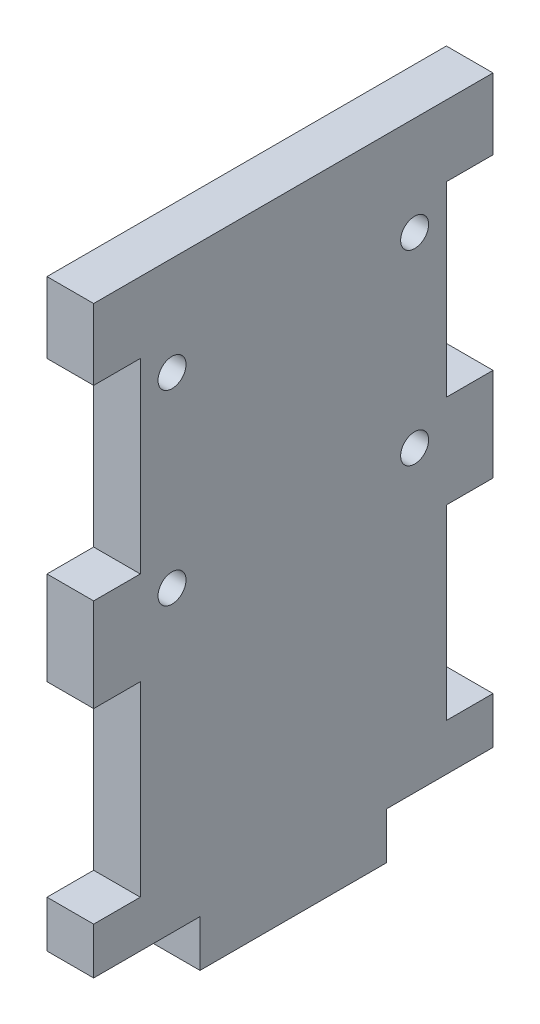
ISO-10303-21;
HEADER;
FILE_DESCRIPTION(('STEP AP214'),'2;1');
FILE_NAME('part.step','',(''),(''),'','','');
FILE_SCHEMA(('AUTOMOTIVE_DESIGN { 1 0 10303 214 1 1 1 1 }'));
ENDSEC;
DATA;
#1=APPLICATION_CONTEXT('core data for automotive mechanical design processes');
#2=APPLICATION_PROTOCOL_DEFINITION('international standard','automotive_design',2000,#1);
#3=PRODUCT_CONTEXT('',#1,'mechanical');
#4=PRODUCT('Part','Part','',(#3));
#5=PRODUCT_RELATED_PRODUCT_CATEGORY('part','',(#4));
#6=PRODUCT_DEFINITION_FORMATION('','',#4);
#7=PRODUCT_DEFINITION_CONTEXT('part definition',#1,'design');
#8=PRODUCT_DEFINITION('design','',#6,#7);
#9=PRODUCT_DEFINITION_SHAPE('','',#8);
#10=(LENGTH_UNIT() NAMED_UNIT(*) SI_UNIT(.MILLI.,.METRE.));
#11=(NAMED_UNIT(*) PLANE_ANGLE_UNIT() SI_UNIT($,.RADIAN.));
#12=(NAMED_UNIT(*) SI_UNIT($,.STERADIAN.) SOLID_ANGLE_UNIT());
#13=UNCERTAINTY_MEASURE_WITH_UNIT(LENGTH_MEASURE(1.E-05),#10,'distance_accuracy_value','');
#14=(GEOMETRIC_REPRESENTATION_CONTEXT(3) GLOBAL_UNCERTAINTY_ASSIGNED_CONTEXT((#13)) GLOBAL_UNIT_ASSIGNED_CONTEXT((#10,
#11,#12)) REPRESENTATION_CONTEXT('',''));
#15=CARTESIAN_POINT('',(0.,0.,0.));
#16=DIRECTION('',(0.,0.,1.));
#17=DIRECTION('',(1.,0.,0.));
#18=AXIS2_PLACEMENT_3D('',#15,#16,#17);
#19=CARTESIAN_POINT('',(6.35,0.,-39.878));
#20=DIRECTION('',(1.,0.,0.));
#21=DIRECTION('',(0.,0.,-1.));
#22=AXIS2_PLACEMENT_3D('',#19,#20,#21);
#23=PLANE('',#22);
#24=CARTESIAN_POINT('',(6.35,46.99,-43.688));
#25=DIRECTION('',(1.,0.,0.));
#26=DIRECTION('',(0.,0.,-1.));
#27=AXIS2_PLACEMENT_3D('',#24,#25,#26);
#28=CIRCLE('',#27,1.905);
#29=CARTESIAN_POINT('',(6.35,46.99,-45.593));
#30=VERTEX_POINT('',#29);
#31=EDGE_CURVE('E446',#30,#30,#28,.T.);
#32=ORIENTED_EDGE('',*,*,#31,.F.);
#33=EDGE_LOOP('',(#32));
#34=FACE_BOUND('',#33,.T.);
#35=CARTESIAN_POINT('',(6.35,72.39,-10.668));
#36=DIRECTION('',(1.,0.,0.));
#37=DIRECTION('',(0.,0.,-1.));
#38=AXIS2_PLACEMENT_3D('',#35,#36,#37);
#39=CIRCLE('',#38,1.90500000000001);
#40=CARTESIAN_POINT('',(6.35,72.39,-12.573));
#41=VERTEX_POINT('',#40);
#42=EDGE_CURVE('E228',#41,#41,#39,.T.);
#43=ORIENTED_EDGE('',*,*,#42,.F.);
#44=EDGE_LOOP('',(#43));
#45=FACE_BOUND('',#44,.T.);
#46=DIRECTION('',(0.,0.,-1.));
#47=VECTOR('',#46,1.);
#48=CARTESIAN_POINT('',(6.35,0.,-14.478));
#49=LINE('',#48,#47);
#50=CARTESIAN_POINT('',(6.35,0.,-14.478));
#51=VERTEX_POINT('',#50);
#52=CARTESIAN_POINT('',(6.35,0.,-39.878));
#53=VERTEX_POINT('',#52);
#54=EDGE_CURVE('E271',#51,#53,#49,.T.);
#55=ORIENTED_EDGE('',*,*,#54,.T.);
#56=DIRECTION('',(0.,1.,0.));
#57=VECTOR('',#56,1.);
#58=CARTESIAN_POINT('',(6.35,0.,-39.878));
#59=LINE('',#58,#57);
#60=CARTESIAN_POINT('',(6.35,6.35,-39.878));
#61=VERTEX_POINT('',#60);
#62=EDGE_CURVE('E139',#53,#61,#59,.T.);
#63=ORIENTED_EDGE('',*,*,#62,.T.);
#64=DIRECTION('',(0.,0.,-1.));
#65=VECTOR('',#64,1.);
#66=CARTESIAN_POINT('',(6.35,6.35,-39.878));
#67=LINE('',#66,#65);
#68=CARTESIAN_POINT('',(6.35,6.35,-54.356));
#69=VERTEX_POINT('',#68);
#70=EDGE_CURVE('E334',#61,#69,#67,.T.);
#71=ORIENTED_EDGE('',*,*,#70,.T.);
#72=DIRECTION('',(0.,1.,0.));
#73=VECTOR('',#72,1.);
#74=CARTESIAN_POINT('',(6.35,6.35,-54.356));
#75=LINE('',#74,#73);
#76=CARTESIAN_POINT('',(6.35,12.7,-54.356));
#77=VERTEX_POINT('',#76);
#78=EDGE_CURVE('E353',#69,#77,#75,.T.);
#79=ORIENTED_EDGE('',*,*,#78,.T.);
#80=DIRECTION('',(0.,0.,1.));
#81=VECTOR('',#80,1.);
#82=CARTESIAN_POINT('',(6.35,12.7,-48.006));
#83=LINE('',#82,#81);
#84=CARTESIAN_POINT('',(6.35,12.7,-48.006));
#85=VERTEX_POINT('',#84);
#86=EDGE_CURVE('E350',#77,#85,#83,.T.);
#87=ORIENTED_EDGE('',*,*,#86,.T.);
#88=DIRECTION('',(0.,1.,0.));
#89=VECTOR('',#88,1.);
#90=CARTESIAN_POINT('',(6.35,38.1,-48.006));
#91=LINE('',#90,#89);
#92=CARTESIAN_POINT('',(6.35,38.1,-48.006));
#93=VERTEX_POINT('',#92);
#94=EDGE_CURVE('E352',#85,#93,#91,.T.);
#95=ORIENTED_EDGE('',*,*,#94,.T.);
#96=DIRECTION('',(0.,0.,-1.));
#97=VECTOR('',#96,1.);
#98=CARTESIAN_POINT('',(6.35,38.1,-54.356));
#99=LINE('',#98,#97);
#100=CARTESIAN_POINT('',(6.35,38.1,-54.356));
#101=VERTEX_POINT('',#100);
#102=EDGE_CURVE('E355',#93,#101,#99,.T.);
#103=ORIENTED_EDGE('',*,*,#102,.T.);
#104=DIRECTION('',(0.,1.,0.));
#105=VECTOR('',#104,1.);
#106=CARTESIAN_POINT('',(6.35,38.1,-54.356));
#107=LINE('',#106,#105);
#108=CARTESIAN_POINT('',(6.35,50.8,-54.356));
#109=VERTEX_POINT('',#108);
#110=EDGE_CURVE('E361',#101,#109,#107,.T.);
#111=ORIENTED_EDGE('',*,*,#110,.T.);
#112=DIRECTION('',(0.,0.,1.));
#113=VECTOR('',#112,1.);
#114=CARTESIAN_POINT('',(6.35,50.8,-48.006));
#115=LINE('',#114,#113);
#116=CARTESIAN_POINT('',(6.35,50.8,-48.006));
#117=VERTEX_POINT('',#116);
#118=EDGE_CURVE('E363',#109,#117,#115,.T.);
#119=ORIENTED_EDGE('',*,*,#118,.T.);
#120=DIRECTION('',(0.,1.,0.));
#121=VECTOR('',#120,1.);
#122=CARTESIAN_POINT('',(6.35,76.2,-48.006));
#123=LINE('',#122,#121);
#124=CARTESIAN_POINT('',(6.35,76.2,-48.006));
#125=VERTEX_POINT('',#124);
#126=EDGE_CURVE('E365',#117,#125,#123,.T.);
#127=ORIENTED_EDGE('',*,*,#126,.T.);
#128=DIRECTION('',(0.,0.,-1.));
#129=VECTOR('',#128,1.);
#130=CARTESIAN_POINT('',(6.35,76.2,-54.356));
#131=LINE('',#130,#129);
#132=CARTESIAN_POINT('',(6.35,76.2,-54.356));
#133=VERTEX_POINT('',#132);
#134=EDGE_CURVE('E367',#125,#133,#131,.T.);
#135=ORIENTED_EDGE('',*,*,#134,.T.);
#136=DIRECTION('',(0.,1.,0.));
#137=VECTOR('',#136,1.);
#138=CARTESIAN_POINT('',(6.35,76.2,-54.356));
#139=LINE('',#138,#137);
#140=CARTESIAN_POINT('',(6.35,85.852,-54.356));
#141=VERTEX_POINT('',#140);
#142=EDGE_CURVE('E369',#133,#141,#139,.T.);
#143=ORIENTED_EDGE('',*,*,#142,.T.);
#144=DIRECTION('',(0.,0.,1.));
#145=VECTOR('',#144,1.);
#146=CARTESIAN_POINT('',(6.35,85.852,-54.356));
#147=LINE('',#146,#145);
#148=CARTESIAN_POINT('',(6.35,85.852,0.));
#149=VERTEX_POINT('',#148);
#150=EDGE_CURVE('E371',#141,#149,#147,.T.);
#151=ORIENTED_EDGE('',*,*,#150,.T.);
#152=DIRECTION('',(0.,-1.,0.));
#153=VECTOR('',#152,1.);
#154=CARTESIAN_POINT('',(6.35,85.852,0.));
#155=LINE('',#154,#153);
#156=CARTESIAN_POINT('',(6.35,76.2,0.));
#157=VERTEX_POINT('',#156);
#158=EDGE_CURVE('E373',#149,#157,#155,.T.);
#159=ORIENTED_EDGE('',*,*,#158,.T.);
#160=DIRECTION('',(0.,0.,-1.));
#161=VECTOR('',#160,1.);
#162=CARTESIAN_POINT('',(6.35,76.2,0.));
#163=LINE('',#162,#161);
#164=CARTESIAN_POINT('',(6.35,76.2,-6.34999999999994));
#165=VERTEX_POINT('',#164);
#166=EDGE_CURVE('E375',#157,#165,#163,.T.);
#167=ORIENTED_EDGE('',*,*,#166,.T.);
#168=DIRECTION('',(0.,-1.,0.));
#169=VECTOR('',#168,1.);
#170=CARTESIAN_POINT('',(6.35,76.2,-6.34999999999994));
#171=LINE('',#170,#169);
#172=CARTESIAN_POINT('',(6.35,50.8,-6.34999999999995));
#173=VERTEX_POINT('',#172);
#174=EDGE_CURVE('E377',#165,#173,#171,.T.);
#175=ORIENTED_EDGE('',*,*,#174,.T.);
#176=DIRECTION('',(0.,0.,1.));
#177=VECTOR('',#176,1.);
#178=CARTESIAN_POINT('',(6.35,50.8,-6.34999999999995));
#179=LINE('',#178,#177);
#180=CARTESIAN_POINT('',(6.35,50.8,0.));
#181=VERTEX_POINT('',#180);
#182=EDGE_CURVE('E379',#173,#181,#179,.T.);
#183=ORIENTED_EDGE('',*,*,#182,.T.);
#184=DIRECTION('',(0.,-1.,0.));
#185=VECTOR('',#184,1.);
#186=CARTESIAN_POINT('',(6.35,50.8,0.));
#187=LINE('',#186,#185);
#188=CARTESIAN_POINT('',(6.35,38.1,0.));
#189=VERTEX_POINT('',#188);
#190=EDGE_CURVE('E381',#181,#189,#187,.T.);
#191=ORIENTED_EDGE('',*,*,#190,.T.);
#192=DIRECTION('',(0.,0.,-1.));
#193=VECTOR('',#192,1.);
#194=CARTESIAN_POINT('',(6.35,38.1,0.));
#195=LINE('',#194,#193);
#196=CARTESIAN_POINT('',(6.35,38.1,-6.34999999999996));
#197=VERTEX_POINT('',#196);
#198=EDGE_CURVE('E383',#189,#197,#195,.T.);
#199=ORIENTED_EDGE('',*,*,#198,.T.);
#200=DIRECTION('',(0.,-1.,0.));
#201=VECTOR('',#200,1.);
#202=CARTESIAN_POINT('',(6.35,38.1,-6.34999999999996));
#203=LINE('',#202,#201);
#204=CARTESIAN_POINT('',(6.35,12.7,-6.34999999999996));
#205=VERTEX_POINT('',#204);
#206=EDGE_CURVE('E385',#197,#205,#203,.T.);
#207=ORIENTED_EDGE('',*,*,#206,.T.);
#208=DIRECTION('',(0.,0.,1.));
#209=VECTOR('',#208,1.);
#210=CARTESIAN_POINT('',(6.35,12.7,-6.34999999999996));
#211=LINE('',#210,#209);
#212=CARTESIAN_POINT('',(6.35,12.7,0.));
#213=VERTEX_POINT('',#212);
#214=EDGE_CURVE('E206',#205,#213,#211,.T.);
#215=ORIENTED_EDGE('',*,*,#214,.T.);
#216=DIRECTION('',(0.,-1.,0.));
#217=VECTOR('',#216,1.);
#218=CARTESIAN_POINT('',(6.35,12.7,0.));
#219=LINE('',#218,#217);
#220=CARTESIAN_POINT('',(6.35,6.35,0.));
#221=VERTEX_POINT('',#220);
#222=EDGE_CURVE('E200',#213,#221,#219,.T.);
#223=ORIENTED_EDGE('',*,*,#222,.T.);
#224=DIRECTION('',(0.,0.,-1.));
#225=VECTOR('',#224,1.);
#226=CARTESIAN_POINT('',(6.35,6.35,0.));
#227=LINE('',#226,#225);
#228=CARTESIAN_POINT('',(6.35,6.34999999999999,-14.478));
#229=VERTEX_POINT('',#228);
#230=EDGE_CURVE('E204',#221,#229,#227,.T.);
#231=ORIENTED_EDGE('',*,*,#230,.T.);
#232=DIRECTION('',(0.,-1.,0.));
#233=VECTOR('',#232,1.);
#234=CARTESIAN_POINT('',(6.35,0.,-14.478));
#235=LINE('',#234,#233);
#236=EDGE_CURVE('E48',#229,#51,#235,.T.);
#237=ORIENTED_EDGE('',*,*,#236,.T.);
#238=EDGE_LOOP('',(#55,#63,#71,#79,#87,#95,#103,#111,#119,#127,#135,#143,#151,#159,#167,#175,
#183,#191,#199,#207,#215,#223,#231,#237));
#239=FACE_BOUND('',#238,.T.);
#240=CARTESIAN_POINT('',(6.35,72.39,-43.688));
#241=DIRECTION('',(1.,0.,0.));
#242=DIRECTION('',(0.,0.,-1.));
#243=AXIS2_PLACEMENT_3D('',#240,#241,#242);
#244=CIRCLE('',#243,1.905);
#245=CARTESIAN_POINT('',(6.35,72.39,-45.593));
#246=VERTEX_POINT('',#245);
#247=EDGE_CURVE('E452',#246,#246,#244,.T.);
#248=ORIENTED_EDGE('',*,*,#247,.F.);
#249=EDGE_LOOP('',(#248));
#250=FACE_BOUND('',#249,.T.);
#251=CARTESIAN_POINT('',(6.35,46.99,-10.668));
#252=DIRECTION('',(1.,0.,0.));
#253=DIRECTION('',(0.,0.,-1.));
#254=AXIS2_PLACEMENT_3D('',#251,#252,#253);
#255=CIRCLE('',#254,1.905);
#256=CARTESIAN_POINT('',(6.35,46.99,-12.573));
#257=VERTEX_POINT('',#256);
#258=EDGE_CURVE('E437',#257,#257,#255,.T.);
#259=ORIENTED_EDGE('',*,*,#258,.F.);
#260=EDGE_LOOP('',(#259));
#261=FACE_BOUND('',#260,.T.);
#262=ADVANCED_FACE('F31',(#34,#45,#239,#250,#261),#23,.T.);
#263=CARTESIAN_POINT('',(0.,0.,-39.878));
#264=DIRECTION('',(1.,0.,0.));
#265=DIRECTION('',(0.,0.,-1.));
#266=AXIS2_PLACEMENT_3D('',#263,#264,#265);
#267=PLANE('',#266);
#268=CARTESIAN_POINT('',(0.,46.99,-43.688));
#269=DIRECTION('',(1.,0.,0.));
#270=DIRECTION('',(0.,0.,-1.));
#271=AXIS2_PLACEMENT_3D('',#268,#269,#270);
#272=CIRCLE('',#271,1.905);
#273=CARTESIAN_POINT('',(0.,46.99,-45.593));
#274=VERTEX_POINT('',#273);
#275=EDGE_CURVE('E443',#274,#274,#272,.T.);
#276=ORIENTED_EDGE('',*,*,#275,.T.);
#277=EDGE_LOOP('',(#276));
#278=FACE_BOUND('',#277,.T.);
#279=CARTESIAN_POINT('',(0.,72.39,-10.668));
#280=DIRECTION('',(1.,0.,0.));
#281=DIRECTION('',(0.,0.,-1.));
#282=AXIS2_PLACEMENT_3D('',#279,#280,#281);
#283=CIRCLE('',#282,1.90500000000001);
#284=CARTESIAN_POINT('',(0.,72.39,-12.573));
#285=VERTEX_POINT('',#284);
#286=EDGE_CURVE('E455',#285,#285,#283,.T.);
#287=ORIENTED_EDGE('',*,*,#286,.T.);
#288=EDGE_LOOP('',(#287));
#289=FACE_BOUND('',#288,.T.);
#290=DIRECTION('',(0.,0.,-1.));
#291=VECTOR('',#290,1.);
#292=CARTESIAN_POINT('',(0.,0.,-14.478));
#293=LINE('',#292,#291);
#294=CARTESIAN_POINT('',(0.,0.,-14.478));
#295=VERTEX_POINT('',#294);
#296=CARTESIAN_POINT('',(0.,0.,-39.878));
#297=VERTEX_POINT('',#296);
#298=EDGE_CURVE('E224',#295,#297,#293,.T.);
#299=ORIENTED_EDGE('',*,*,#298,.F.);
#300=DIRECTION('',(0.,-1.,0.));
#301=VECTOR('',#300,1.);
#302=CARTESIAN_POINT('',(0.,0.,-14.478));
#303=LINE('',#302,#301);
#304=CARTESIAN_POINT('',(0.,6.34999999999999,-14.478));
#305=VERTEX_POINT('',#304);
#306=EDGE_CURVE('E131',#305,#295,#303,.T.);
#307=ORIENTED_EDGE('',*,*,#306,.F.);
#308=DIRECTION('',(0.,0.,-1.));
#309=VECTOR('',#308,1.);
#310=CARTESIAN_POINT('',(0.,6.35,0.));
#311=LINE('',#310,#309);
#312=CARTESIAN_POINT('',(0.,6.35,0.));
#313=VERTEX_POINT('',#312);
#314=EDGE_CURVE('E125',#313,#305,#311,.T.);
#315=ORIENTED_EDGE('',*,*,#314,.F.);
#316=DIRECTION('',(0.,-1.,0.));
#317=VECTOR('',#316,1.);
#318=CARTESIAN_POINT('',(0.,12.7,0.));
#319=LINE('',#318,#317);
#320=CARTESIAN_POINT('',(0.,12.7,0.));
#321=VERTEX_POINT('',#320);
#322=EDGE_CURVE('E214',#321,#313,#319,.T.);
#323=ORIENTED_EDGE('',*,*,#322,.F.);
#324=DIRECTION('',(0.,0.,1.));
#325=VECTOR('',#324,1.);
#326=CARTESIAN_POINT('',(0.,12.7,-6.34999999999996));
#327=LINE('',#326,#325);
#328=CARTESIAN_POINT('',(0.,12.7,-6.34999999999996));
#329=VERTEX_POINT('',#328);
#330=EDGE_CURVE('E266',#329,#321,#327,.T.);
#331=ORIENTED_EDGE('',*,*,#330,.F.);
#332=DIRECTION('',(0.,-1.,0.));
#333=VECTOR('',#332,1.);
#334=CARTESIAN_POINT('',(0.,38.1,-6.34999999999996));
#335=LINE('',#334,#333);
#336=CARTESIAN_POINT('',(0.,38.1,-6.34999999999996));
#337=VERTEX_POINT('',#336);
#338=EDGE_CURVE('E264',#337,#329,#335,.T.);
#339=ORIENTED_EDGE('',*,*,#338,.F.);
#340=DIRECTION('',(0.,0.,-1.));
#341=VECTOR('',#340,1.);
#342=CARTESIAN_POINT('',(0.,38.1,0.));
#343=LINE('',#342,#341);
#344=CARTESIAN_POINT('',(0.,38.1,0.));
#345=VERTEX_POINT('',#344);
#346=EDGE_CURVE('E262',#345,#337,#343,.T.);
#347=ORIENTED_EDGE('',*,*,#346,.F.);
#348=DIRECTION('',(0.,-1.,0.));
#349=VECTOR('',#348,1.);
#350=CARTESIAN_POINT('',(0.,50.8,0.));
#351=LINE('',#350,#349);
#352=CARTESIAN_POINT('',(0.,50.8,0.));
#353=VERTEX_POINT('',#352);
#354=EDGE_CURVE('E260',#353,#345,#351,.T.);
#355=ORIENTED_EDGE('',*,*,#354,.F.);
#356=DIRECTION('',(0.,0.,1.));
#357=VECTOR('',#356,1.);
#358=CARTESIAN_POINT('',(0.,50.8,-6.34999999999995));
#359=LINE('',#358,#357);
#360=CARTESIAN_POINT('',(0.,50.8,-6.34999999999995));
#361=VERTEX_POINT('',#360);
#362=EDGE_CURVE('E258',#361,#353,#359,.T.);
#363=ORIENTED_EDGE('',*,*,#362,.F.);
#364=DIRECTION('',(0.,-1.,0.));
#365=VECTOR('',#364,1.);
#366=CARTESIAN_POINT('',(0.,76.2,-6.34999999999994));
#367=LINE('',#366,#365);
#368=CARTESIAN_POINT('',(0.,76.2,-6.34999999999994));
#369=VERTEX_POINT('',#368);
#370=EDGE_CURVE('E256',#369,#361,#367,.T.);
#371=ORIENTED_EDGE('',*,*,#370,.F.);
#372=DIRECTION('',(0.,0.,-1.));
#373=VECTOR('',#372,1.);
#374=CARTESIAN_POINT('',(0.,76.2,0.));
#375=LINE('',#374,#373);
#376=CARTESIAN_POINT('',(0.,76.2,0.));
#377=VERTEX_POINT('',#376);
#378=EDGE_CURVE('E254',#377,#369,#375,.T.);
#379=ORIENTED_EDGE('',*,*,#378,.F.);
#380=DIRECTION('',(0.,-1.,0.));
#381=VECTOR('',#380,1.);
#382=CARTESIAN_POINT('',(0.,85.852,0.));
#383=LINE('',#382,#381);
#384=CARTESIAN_POINT('',(0.,85.852,0.));
#385=VERTEX_POINT('',#384);
#386=EDGE_CURVE('E252',#385,#377,#383,.T.);
#387=ORIENTED_EDGE('',*,*,#386,.F.);
#388=DIRECTION('',(0.,0.,1.));
#389=VECTOR('',#388,1.);
#390=CARTESIAN_POINT('',(0.,85.852,-54.356));
#391=LINE('',#390,#389);
#392=CARTESIAN_POINT('',(0.,85.852,-54.356));
#393=VERTEX_POINT('',#392);
#394=EDGE_CURVE('E250',#393,#385,#391,.T.);
#395=ORIENTED_EDGE('',*,*,#394,.F.);
#396=DIRECTION('',(0.,1.,0.));
#397=VECTOR('',#396,1.);
#398=CARTESIAN_POINT('',(0.,76.2,-54.356));
#399=LINE('',#398,#397);
#400=CARTESIAN_POINT('',(0.,76.2,-54.356));
#401=VERTEX_POINT('',#400);
#402=EDGE_CURVE('E248',#401,#393,#399,.T.);
#403=ORIENTED_EDGE('',*,*,#402,.F.);
#404=DIRECTION('',(0.,0.,-1.));
#405=VECTOR('',#404,1.);
#406=CARTESIAN_POINT('',(0.,76.2,-54.356));
#407=LINE('',#406,#405);
#408=CARTESIAN_POINT('',(0.,76.2,-48.006));
#409=VERTEX_POINT('',#408);
#410=EDGE_CURVE('E246',#409,#401,#407,.T.);
#411=ORIENTED_EDGE('',*,*,#410,.F.);
#412=DIRECTION('',(0.,1.,0.));
#413=VECTOR('',#412,1.);
#414=CARTESIAN_POINT('',(0.,76.2,-48.006));
#415=LINE('',#414,#413);
#416=CARTESIAN_POINT('',(0.,50.8,-48.006));
#417=VERTEX_POINT('',#416);
#418=EDGE_CURVE('E244',#417,#409,#415,.T.);
#419=ORIENTED_EDGE('',*,*,#418,.F.);
#420=DIRECTION('',(0.,0.,1.));
#421=VECTOR('',#420,1.);
#422=CARTESIAN_POINT('',(0.,50.8,-48.006));
#423=LINE('',#422,#421);
#424=CARTESIAN_POINT('',(0.,50.8,-54.356));
#425=VERTEX_POINT('',#424);
#426=EDGE_CURVE('E242',#425,#417,#423,.T.);
#427=ORIENTED_EDGE('',*,*,#426,.F.);
#428=DIRECTION('',(0.,1.,0.));
#429=VECTOR('',#428,1.);
#430=CARTESIAN_POINT('',(0.,38.1,-54.356));
#431=LINE('',#430,#429);
#432=CARTESIAN_POINT('',(0.,38.1,-54.356));
#433=VERTEX_POINT('',#432);
#434=EDGE_CURVE('E240',#433,#425,#431,.T.);
#435=ORIENTED_EDGE('',*,*,#434,.F.);
#436=DIRECTION('',(0.,0.,-1.));
#437=VECTOR('',#436,1.);
#438=CARTESIAN_POINT('',(0.,38.1,-54.356));
#439=LINE('',#438,#437);
#440=CARTESIAN_POINT('',(0.,38.1,-48.006));
#441=VERTEX_POINT('',#440);
#442=EDGE_CURVE('E238',#441,#433,#439,.T.);
#443=ORIENTED_EDGE('',*,*,#442,.F.);
#444=DIRECTION('',(0.,1.,0.));
#445=VECTOR('',#444,1.);
#446=CARTESIAN_POINT('',(0.,38.1,-48.006));
#447=LINE('',#446,#445);
#448=CARTESIAN_POINT('',(0.,12.7,-48.006));
#449=VERTEX_POINT('',#448);
#450=EDGE_CURVE('E236',#449,#441,#447,.T.);
#451=ORIENTED_EDGE('',*,*,#450,.F.);
#452=DIRECTION('',(0.,0.,1.));
#453=VECTOR('',#452,1.);
#454=CARTESIAN_POINT('',(0.,12.7,-48.006));
#455=LINE('',#454,#453);
#456=CARTESIAN_POINT('',(0.,12.7,-54.356));
#457=VERTEX_POINT('',#456);
#458=EDGE_CURVE('E234',#457,#449,#455,.T.);
#459=ORIENTED_EDGE('',*,*,#458,.F.);
#460=DIRECTION('',(0.,1.,0.));
#461=VECTOR('',#460,1.);
#462=CARTESIAN_POINT('',(0.,6.35,-54.356));
#463=LINE('',#462,#461);
#464=CARTESIAN_POINT('',(0.,6.35,-54.356));
#465=VERTEX_POINT('',#464);
#466=EDGE_CURVE('E232',#465,#457,#463,.T.);
#467=ORIENTED_EDGE('',*,*,#466,.F.);
#468=DIRECTION('',(0.,0.,-1.));
#469=VECTOR('',#468,1.);
#470=CARTESIAN_POINT('',(0.,6.35,-39.878));
#471=LINE('',#470,#469);
#472=CARTESIAN_POINT('',(0.,6.35,-39.878));
#473=VERTEX_POINT('',#472);
#474=EDGE_CURVE('E230',#473,#465,#471,.T.);
#475=ORIENTED_EDGE('',*,*,#474,.F.);
#476=DIRECTION('',(0.,1.,0.));
#477=VECTOR('',#476,1.);
#478=CARTESIAN_POINT('',(0.,0.,-39.878));
#479=LINE('',#478,#477);
#480=EDGE_CURVE('E227',#297,#473,#479,.T.);
#481=ORIENTED_EDGE('',*,*,#480,.F.);
#482=EDGE_LOOP('',(#299,#307,#315,#323,#331,#339,#347,#355,#363,#371,#379,#387,#395,#403,#411,
#419,#427,#435,#443,#451,#459,#467,#475,#481));
#483=FACE_BOUND('',#482,.T.);
#484=CARTESIAN_POINT('',(0.,72.39,-43.688));
#485=DIRECTION('',(1.,0.,0.));
#486=DIRECTION('',(0.,0.,-1.));
#487=AXIS2_PLACEMENT_3D('',#484,#485,#486);
#488=CIRCLE('',#487,1.905);
#489=CARTESIAN_POINT('',(0.,72.39,-45.593));
#490=VERTEX_POINT('',#489);
#491=EDGE_CURVE('E449',#490,#490,#488,.T.);
#492=ORIENTED_EDGE('',*,*,#491,.T.);
#493=EDGE_LOOP('',(#492));
#494=FACE_BOUND('',#493,.T.);
#495=CARTESIAN_POINT('',(0.,46.99,-10.668));
#496=DIRECTION('',(1.,0.,0.));
#497=DIRECTION('',(0.,0.,-1.));
#498=AXIS2_PLACEMENT_3D('',#495,#496,#497);
#499=CIRCLE('',#498,1.905);
#500=CARTESIAN_POINT('',(0.,46.99,-12.573));
#501=VERTEX_POINT('',#500);
#502=EDGE_CURVE('E440',#501,#501,#499,.T.);
#503=ORIENTED_EDGE('',*,*,#502,.T.);
#504=EDGE_LOOP('',(#503));
#505=FACE_BOUND('',#504,.T.);
#506=ADVANCED_FACE('F338',(#278,#289,#483,#494,#505),#267,.F.);
#507=CARTESIAN_POINT('',(6.35,0.,-14.478));
#508=DIRECTION('',(0.,1.,0.));
#509=DIRECTION('',(0.,0.,1.));
#510=AXIS2_PLACEMENT_3D('',#507,#508,#509);
#511=PLANE('',#510);
#512=ORIENTED_EDGE('',*,*,#298,.T.);
#513=DIRECTION('',(-1.,0.,0.));
#514=VECTOR('',#513,1.);
#515=CARTESIAN_POINT('',(6.35,0.,-39.878));
#516=LINE('',#515,#514);
#517=EDGE_CURVE('E11',#53,#297,#516,.T.);
#518=ORIENTED_EDGE('',*,*,#517,.F.);
#519=ORIENTED_EDGE('',*,*,#54,.F.);
#520=DIRECTION('',(-1.,0.,0.));
#521=VECTOR('',#520,1.);
#522=CARTESIAN_POINT('',(6.35,0.,-14.478));
#523=LINE('',#522,#521);
#524=EDGE_CURVE('E220',#51,#295,#523,.T.);
#525=ORIENTED_EDGE('',*,*,#524,.T.);
#526=EDGE_LOOP('',(#512,#518,#519,#525));
#527=FACE_BOUND('',#526,.T.);
#528=ADVANCED_FACE('F33',(#527),#511,.F.);
#529=CARTESIAN_POINT('',(6.35,0.,-39.878));
#530=DIRECTION('',(0.,0.,1.));
#531=DIRECTION('',(1.,0.,0.));
#532=AXIS2_PLACEMENT_3D('',#529,#530,#531);
#533=PLANE('',#532);
#534=ORIENTED_EDGE('',*,*,#480,.T.);
#535=DIRECTION('',(-1.,0.,0.));
#536=VECTOR('',#535,1.);
#537=CARTESIAN_POINT('',(6.35,6.35,-39.878));
#538=LINE('',#537,#536);
#539=EDGE_CURVE('E40',#61,#473,#538,.T.);
#540=ORIENTED_EDGE('',*,*,#539,.F.);
#541=ORIENTED_EDGE('',*,*,#62,.F.);
#542=ORIENTED_EDGE('',*,*,#517,.T.);
#543=EDGE_LOOP('',(#534,#540,#541,#542));
#544=FACE_BOUND('',#543,.T.);
#545=ADVANCED_FACE('F684',(#544),#533,.F.);
#546=CARTESIAN_POINT('',(6.35,6.35,-39.878));
#547=DIRECTION('',(0.,1.,0.));
#548=DIRECTION('',(0.,0.,1.));
#549=AXIS2_PLACEMENT_3D('',#546,#547,#548);
#550=PLANE('',#549);
#551=ORIENTED_EDGE('',*,*,#474,.T.);
#552=DIRECTION('',(-1.,0.,0.));
#553=VECTOR('',#552,1.);
#554=CARTESIAN_POINT('',(6.35,6.35,-54.356));
#555=LINE('',#554,#553);
#556=EDGE_CURVE('E326',#69,#465,#555,.T.);
#557=ORIENTED_EDGE('',*,*,#556,.F.);
#558=ORIENTED_EDGE('',*,*,#70,.F.);
#559=ORIENTED_EDGE('',*,*,#539,.T.);
#560=EDGE_LOOP('',(#551,#557,#558,#559));
#561=FACE_BOUND('',#560,.T.);
#562=ADVANCED_FACE('F332',(#561),#550,.F.);
#563=CARTESIAN_POINT('',(6.35,6.35,-54.356));
#564=DIRECTION('',(0.,0.,1.));
#565=DIRECTION('',(1.,0.,0.));
#566=AXIS2_PLACEMENT_3D('',#563,#564,#565);
#567=PLANE('',#566);
#568=ORIENTED_EDGE('',*,*,#466,.T.);
#569=DIRECTION('',(-1.,0.,0.));
#570=VECTOR('',#569,1.);
#571=CARTESIAN_POINT('',(6.35,12.7,-54.356));
#572=LINE('',#571,#570);
#573=EDGE_CURVE('E323',#77,#457,#572,.T.);
#574=ORIENTED_EDGE('',*,*,#573,.F.);
#575=ORIENTED_EDGE('',*,*,#78,.F.);
#576=ORIENTED_EDGE('',*,*,#556,.T.);
#577=EDGE_LOOP('',(#568,#574,#575,#576));
#578=FACE_BOUND('',#577,.T.);
#579=ADVANCED_FACE('F344',(#578),#567,.F.);
#580=CARTESIAN_POINT('',(6.35,12.7,-48.006));
#581=DIRECTION('',(0.,-1.,0.));
#582=DIRECTION('',(0.,0.,-1.));
#583=AXIS2_PLACEMENT_3D('',#580,#581,#582);
#584=PLANE('',#583);
#585=ORIENTED_EDGE('',*,*,#458,.T.);
#586=DIRECTION('',(-1.,0.,0.));
#587=VECTOR('',#586,1.);
#588=CARTESIAN_POINT('',(6.35,12.7,-48.006));
#589=LINE('',#588,#587);
#590=EDGE_CURVE('E320',#85,#449,#589,.T.);
#591=ORIENTED_EDGE('',*,*,#590,.F.);
#592=ORIENTED_EDGE('',*,*,#86,.F.);
#593=ORIENTED_EDGE('',*,*,#573,.T.);
#594=EDGE_LOOP('',(#585,#591,#592,#593));
#595=FACE_BOUND('',#594,.T.);
#596=ADVANCED_FACE('F348',(#595),#584,.F.);
#597=CARTESIAN_POINT('',(6.35,38.1,-48.006));
#598=DIRECTION('',(0.,0.,1.));
#599=DIRECTION('',(0.,-1.,0.));
#600=AXIS2_PLACEMENT_3D('',#597,#598,#599);
#601=PLANE('',#600);
#602=ORIENTED_EDGE('',*,*,#450,.T.);
#603=DIRECTION('',(-1.,0.,0.));
#604=VECTOR('',#603,1.);
#605=CARTESIAN_POINT('',(6.35,38.1,-48.006));
#606=LINE('',#605,#604);
#607=EDGE_CURVE('E317',#93,#441,#606,.T.);
#608=ORIENTED_EDGE('',*,*,#607,.F.);
#609=ORIENTED_EDGE('',*,*,#94,.F.);
#610=ORIENTED_EDGE('',*,*,#590,.T.);
#611=EDGE_LOOP('',(#602,#608,#609,#610));
#612=FACE_BOUND('',#611,.T.);
#613=ADVANCED_FACE('F649',(#612),#601,.F.);
#614=CARTESIAN_POINT('',(6.35,38.1,-54.356));
#615=DIRECTION('',(0.,1.,0.));
#616=DIRECTION('',(0.,0.,1.));
#617=AXIS2_PLACEMENT_3D('',#614,#615,#616);
#618=PLANE('',#617);
#619=ORIENTED_EDGE('',*,*,#442,.T.);
#620=DIRECTION('',(-1.,0.,0.));
#621=VECTOR('',#620,1.);
#622=CARTESIAN_POINT('',(6.35,38.1,-54.356));
#623=LINE('',#622,#621);
#624=EDGE_CURVE('E314',#101,#433,#623,.T.);
#625=ORIENTED_EDGE('',*,*,#624,.F.);
#626=ORIENTED_EDGE('',*,*,#102,.F.);
#627=ORIENTED_EDGE('',*,*,#607,.T.);
#628=EDGE_LOOP('',(#619,#625,#626,#627));
#629=FACE_BOUND('',#628,.T.);
#630=ADVANCED_FACE('F639',(#629),#618,.F.);
#631=CARTESIAN_POINT('',(6.35,38.1,-54.356));
#632=DIRECTION('',(0.,0.,1.));
#633=DIRECTION('',(1.,0.,0.));
#634=AXIS2_PLACEMENT_3D('',#631,#632,#633);
#635=PLANE('',#634);
#636=ORIENTED_EDGE('',*,*,#434,.T.);
#637=DIRECTION('',(-1.,0.,0.));
#638=VECTOR('',#637,1.);
#639=CARTESIAN_POINT('',(6.35,50.8,-54.356));
#640=LINE('',#639,#638);
#641=EDGE_CURVE('E311',#109,#425,#640,.T.);
#642=ORIENTED_EDGE('',*,*,#641,.F.);
#643=ORIENTED_EDGE('',*,*,#110,.F.);
#644=ORIENTED_EDGE('',*,*,#624,.T.);
#645=EDGE_LOOP('',(#636,#642,#643,#644));
#646=FACE_BOUND('',#645,.T.);
#647=ADVANCED_FACE('F629',(#646),#635,.F.);
#648=CARTESIAN_POINT('',(6.35,50.8,-48.006));
#649=DIRECTION('',(0.,-1.,0.));
#650=DIRECTION('',(0.,0.,-1.));
#651=AXIS2_PLACEMENT_3D('',#648,#649,#650);
#652=PLANE('',#651);
#653=ORIENTED_EDGE('',*,*,#426,.T.);
#654=DIRECTION('',(-1.,0.,0.));
#655=VECTOR('',#654,1.);
#656=CARTESIAN_POINT('',(6.35,50.8,-48.006));
#657=LINE('',#656,#655);
#658=EDGE_CURVE('E308',#117,#417,#657,.T.);
#659=ORIENTED_EDGE('',*,*,#658,.F.);
#660=ORIENTED_EDGE('',*,*,#118,.F.);
#661=ORIENTED_EDGE('',*,*,#641,.T.);
#662=EDGE_LOOP('',(#653,#659,#660,#661));
#663=FACE_BOUND('',#662,.T.);
#664=ADVANCED_FACE('F619',(#663),#652,.F.);
#665=CARTESIAN_POINT('',(6.35,76.2,-48.006));
#666=DIRECTION('',(0.,0.,1.));
#667=DIRECTION('',(0.,-1.,0.));
#668=AXIS2_PLACEMENT_3D('',#665,#666,#667);
#669=PLANE('',#668);
#670=ORIENTED_EDGE('',*,*,#418,.T.);
#671=DIRECTION('',(-1.,0.,0.));
#672=VECTOR('',#671,1.);
#673=CARTESIAN_POINT('',(6.35,76.2,-48.006));
#674=LINE('',#673,#672);
#675=EDGE_CURVE('E305',#125,#409,#674,.T.);
#676=ORIENTED_EDGE('',*,*,#675,.F.);
#677=ORIENTED_EDGE('',*,*,#126,.F.);
#678=ORIENTED_EDGE('',*,*,#658,.T.);
#679=EDGE_LOOP('',(#670,#676,#677,#678));
#680=FACE_BOUND('',#679,.T.);
#681=ADVANCED_FACE('F609',(#680),#669,.F.);
#682=CARTESIAN_POINT('',(6.35,76.2,-54.356));
#683=DIRECTION('',(0.,1.,0.));
#684=DIRECTION('',(0.,0.,1.));
#685=AXIS2_PLACEMENT_3D('',#682,#683,#684);
#686=PLANE('',#685);
#687=ORIENTED_EDGE('',*,*,#410,.T.);
#688=DIRECTION('',(-1.,0.,0.));
#689=VECTOR('',#688,1.);
#690=CARTESIAN_POINT('',(6.35,76.2,-54.356));
#691=LINE('',#690,#689);
#692=EDGE_CURVE('E302',#133,#401,#691,.T.);
#693=ORIENTED_EDGE('',*,*,#692,.F.);
#694=ORIENTED_EDGE('',*,*,#134,.F.);
#695=ORIENTED_EDGE('',*,*,#675,.T.);
#696=EDGE_LOOP('',(#687,#693,#694,#695));
#697=FACE_BOUND('',#696,.T.);
#698=ADVANCED_FACE('F599',(#697),#686,.F.);
#699=CARTESIAN_POINT('',(6.35,76.2,-54.356));
#700=DIRECTION('',(0.,0.,1.));
#701=DIRECTION('',(1.,0.,0.));
#702=AXIS2_PLACEMENT_3D('',#699,#700,#701);
#703=PLANE('',#702);
#704=ORIENTED_EDGE('',*,*,#402,.T.);
#705=DIRECTION('',(-1.,0.,0.));
#706=VECTOR('',#705,1.);
#707=CARTESIAN_POINT('',(6.35,85.852,-54.356));
#708=LINE('',#707,#706);
#709=EDGE_CURVE('E299',#141,#393,#708,.T.);
#710=ORIENTED_EDGE('',*,*,#709,.F.);
#711=ORIENTED_EDGE('',*,*,#142,.F.);
#712=ORIENTED_EDGE('',*,*,#692,.T.);
#713=EDGE_LOOP('',(#704,#710,#711,#712));
#714=FACE_BOUND('',#713,.T.);
#715=ADVANCED_FACE('F589',(#714),#703,.F.);
#716=CARTESIAN_POINT('',(6.35,85.852,-54.356));
#717=DIRECTION('',(0.,-1.,0.));
#718=DIRECTION('',(0.,0.,-1.));
#719=AXIS2_PLACEMENT_3D('',#716,#717,#718);
#720=PLANE('',#719);
#721=ORIENTED_EDGE('',*,*,#394,.T.);
#722=DIRECTION('',(-1.,0.,0.));
#723=VECTOR('',#722,1.);
#724=CARTESIAN_POINT('',(6.35,85.852,0.));
#725=LINE('',#724,#723);
#726=EDGE_CURVE('E296',#149,#385,#725,.T.);
#727=ORIENTED_EDGE('',*,*,#726,.F.);
#728=ORIENTED_EDGE('',*,*,#150,.F.);
#729=ORIENTED_EDGE('',*,*,#709,.T.);
#730=EDGE_LOOP('',(#721,#727,#728,#729));
#731=FACE_BOUND('',#730,.T.);
#732=ADVANCED_FACE('F579',(#731),#720,.F.);
#733=CARTESIAN_POINT('',(6.35,85.852,0.));
#734=DIRECTION('',(0.,0.,-1.));
#735=DIRECTION('',(0.,1.,0.));
#736=AXIS2_PLACEMENT_3D('',#733,#734,#735);
#737=PLANE('',#736);
#738=ORIENTED_EDGE('',*,*,#386,.T.);
#739=DIRECTION('',(-1.,0.,0.));
#740=VECTOR('',#739,1.);
#741=CARTESIAN_POINT('',(6.35,76.2,0.));
#742=LINE('',#741,#740);
#743=EDGE_CURVE('E293',#157,#377,#742,.T.);
#744=ORIENTED_EDGE('',*,*,#743,.F.);
#745=ORIENTED_EDGE('',*,*,#158,.F.);
#746=ORIENTED_EDGE('',*,*,#726,.T.);
#747=EDGE_LOOP('',(#738,#744,#745,#746));
#748=FACE_BOUND('',#747,.T.);
#749=ADVANCED_FACE('F569',(#748),#737,.F.);
#750=CARTESIAN_POINT('',(6.35,76.2,0.));
#751=DIRECTION('',(0.,1.,0.));
#752=DIRECTION('',(0.,0.,1.));
#753=AXIS2_PLACEMENT_3D('',#750,#751,#752);
#754=PLANE('',#753);
#755=ORIENTED_EDGE('',*,*,#378,.T.);
#756=DIRECTION('',(-1.,0.,0.));
#757=VECTOR('',#756,1.);
#758=CARTESIAN_POINT('',(6.35,76.2,-6.34999999999994));
#759=LINE('',#758,#757);
#760=EDGE_CURVE('E290',#165,#369,#759,.T.);
#761=ORIENTED_EDGE('',*,*,#760,.F.);
#762=ORIENTED_EDGE('',*,*,#166,.F.);
#763=ORIENTED_EDGE('',*,*,#743,.T.);
#764=EDGE_LOOP('',(#755,#761,#762,#763));
#765=FACE_BOUND('',#764,.T.);
#766=ADVANCED_FACE('F559',(#765),#754,.F.);
#767=CARTESIAN_POINT('',(6.35,76.2,-6.34999999999994));
#768=DIRECTION('',(0.,0.,-1.));
#769=DIRECTION('',(0.,1.,0.));
#770=AXIS2_PLACEMENT_3D('',#767,#768,#769);
#771=PLANE('',#770);
#772=ORIENTED_EDGE('',*,*,#370,.T.);
#773=DIRECTION('',(-1.,0.,0.));
#774=VECTOR('',#773,1.);
#775=CARTESIAN_POINT('',(6.35,50.8,-6.34999999999995));
#776=LINE('',#775,#774);
#777=EDGE_CURVE('E287',#173,#361,#776,.T.);
#778=ORIENTED_EDGE('',*,*,#777,.F.);
#779=ORIENTED_EDGE('',*,*,#174,.F.);
#780=ORIENTED_EDGE('',*,*,#760,.T.);
#781=EDGE_LOOP('',(#772,#778,#779,#780));
#782=FACE_BOUND('',#781,.T.);
#783=ADVANCED_FACE('F549',(#782),#771,.F.);
#784=CARTESIAN_POINT('',(6.35,50.8,-6.34999999999995));
#785=DIRECTION('',(0.,-1.,0.));
#786=DIRECTION('',(0.,0.,-1.));
#787=AXIS2_PLACEMENT_3D('',#784,#785,#786);
#788=PLANE('',#787);
#789=ORIENTED_EDGE('',*,*,#362,.T.);
#790=DIRECTION('',(-1.,0.,0.));
#791=VECTOR('',#790,1.);
#792=CARTESIAN_POINT('',(6.35,50.8,0.));
#793=LINE('',#792,#791);
#794=EDGE_CURVE('E284',#181,#353,#793,.T.);
#795=ORIENTED_EDGE('',*,*,#794,.F.);
#796=ORIENTED_EDGE('',*,*,#182,.F.);
#797=ORIENTED_EDGE('',*,*,#777,.T.);
#798=EDGE_LOOP('',(#789,#795,#796,#797));
#799=FACE_BOUND('',#798,.T.);
#800=ADVANCED_FACE('F539',(#799),#788,.F.);
#801=CARTESIAN_POINT('',(6.35,50.8,0.));
#802=DIRECTION('',(0.,0.,-1.));
#803=DIRECTION('',(0.,1.,0.));
#804=AXIS2_PLACEMENT_3D('',#801,#802,#803);
#805=PLANE('',#804);
#806=ORIENTED_EDGE('',*,*,#354,.T.);
#807=DIRECTION('',(-1.,0.,0.));
#808=VECTOR('',#807,1.);
#809=CARTESIAN_POINT('',(6.35,38.1,0.));
#810=LINE('',#809,#808);
#811=EDGE_CURVE('E281',#189,#345,#810,.T.);
#812=ORIENTED_EDGE('',*,*,#811,.F.);
#813=ORIENTED_EDGE('',*,*,#190,.F.);
#814=ORIENTED_EDGE('',*,*,#794,.T.);
#815=EDGE_LOOP('',(#806,#812,#813,#814));
#816=FACE_BOUND('',#815,.T.);
#817=ADVANCED_FACE('F529',(#816),#805,.F.);
#818=CARTESIAN_POINT('',(6.35,38.1,0.));
#819=DIRECTION('',(0.,1.,0.));
#820=DIRECTION('',(0.,0.,1.));
#821=AXIS2_PLACEMENT_3D('',#818,#819,#820);
#822=PLANE('',#821);
#823=ORIENTED_EDGE('',*,*,#346,.T.);
#824=DIRECTION('',(-1.,0.,0.));
#825=VECTOR('',#824,1.);
#826=CARTESIAN_POINT('',(6.35,38.1,-6.34999999999996));
#827=LINE('',#826,#825);
#828=EDGE_CURVE('E278',#197,#337,#827,.T.);
#829=ORIENTED_EDGE('',*,*,#828,.F.);
#830=ORIENTED_EDGE('',*,*,#198,.F.);
#831=ORIENTED_EDGE('',*,*,#811,.T.);
#832=EDGE_LOOP('',(#823,#829,#830,#831));
#833=FACE_BOUND('',#832,.T.);
#834=ADVANCED_FACE('F520',(#833),#822,.F.);
#835=CARTESIAN_POINT('',(6.35,38.1,-6.34999999999996));
#836=DIRECTION('',(0.,0.,-1.));
#837=DIRECTION('',(0.,1.,0.));
#838=AXIS2_PLACEMENT_3D('',#835,#836,#837);
#839=PLANE('',#838);
#840=ORIENTED_EDGE('',*,*,#338,.T.);
#841=DIRECTION('',(-1.,0.,0.));
#842=VECTOR('',#841,1.);
#843=CARTESIAN_POINT('',(6.35,12.7,-6.34999999999996));
#844=LINE('',#843,#842);
#845=EDGE_CURVE('E275',#205,#329,#844,.T.);
#846=ORIENTED_EDGE('',*,*,#845,.F.);
#847=ORIENTED_EDGE('',*,*,#206,.F.);
#848=ORIENTED_EDGE('',*,*,#828,.T.);
#849=EDGE_LOOP('',(#840,#846,#847,#848));
#850=FACE_BOUND('',#849,.T.);
#851=ADVANCED_FACE('F391',(#850),#839,.F.);
#852=CARTESIAN_POINT('',(6.35,12.7,-6.34999999999996));
#853=DIRECTION('',(0.,-1.,0.));
#854=DIRECTION('',(0.,0.,-1.));
#855=AXIS2_PLACEMENT_3D('',#852,#853,#854);
#856=PLANE('',#855);
#857=ORIENTED_EDGE('',*,*,#330,.T.);
#858=DIRECTION('',(-1.,0.,0.));
#859=VECTOR('',#858,1.);
#860=CARTESIAN_POINT('',(6.35,12.7,0.));
#861=LINE('',#860,#859);
#862=EDGE_CURVE('E215',#213,#321,#861,.T.);
#863=ORIENTED_EDGE('',*,*,#862,.F.);
#864=ORIENTED_EDGE('',*,*,#214,.F.);
#865=ORIENTED_EDGE('',*,*,#845,.T.);
#866=EDGE_LOOP('',(#857,#863,#864,#865));
#867=FACE_BOUND('',#866,.T.);
#868=ADVANCED_FACE('F395',(#867),#856,.F.);
#869=CARTESIAN_POINT('',(6.35,12.7,0.));
#870=DIRECTION('',(0.,0.,-1.));
#871=DIRECTION('',(0.,1.,0.));
#872=AXIS2_PLACEMENT_3D('',#869,#870,#871);
#873=PLANE('',#872);
#874=ORIENTED_EDGE('',*,*,#322,.T.);
#875=DIRECTION('',(-1.,0.,0.));
#876=VECTOR('',#875,1.);
#877=CARTESIAN_POINT('',(6.35,6.35,0.));
#878=LINE('',#877,#876);
#879=EDGE_CURVE('E211',#221,#313,#878,.T.);
#880=ORIENTED_EDGE('',*,*,#879,.F.);
#881=ORIENTED_EDGE('',*,*,#222,.F.);
#882=ORIENTED_EDGE('',*,*,#862,.T.);
#883=EDGE_LOOP('',(#874,#880,#881,#882));
#884=FACE_BOUND('',#883,.T.);
#885=ADVANCED_FACE('F212',(#884),#873,.F.);
#886=CARTESIAN_POINT('',(6.35,6.35,0.));
#887=DIRECTION('',(0.,1.,0.));
#888=DIRECTION('',(0.,0.,1.));
#889=AXIS2_PLACEMENT_3D('',#886,#887,#888);
#890=PLANE('',#889);
#891=ORIENTED_EDGE('',*,*,#314,.T.);
#892=DIRECTION('',(-1.,0.,0.));
#893=VECTOR('',#892,1.);
#894=CARTESIAN_POINT('',(6.35,6.34999999999999,-14.478));
#895=LINE('',#894,#893);
#896=EDGE_CURVE('E216',#229,#305,#895,.T.);
#897=ORIENTED_EDGE('',*,*,#896,.F.);
#898=ORIENTED_EDGE('',*,*,#230,.F.);
#899=ORIENTED_EDGE('',*,*,#879,.T.);
#900=EDGE_LOOP('',(#891,#897,#898,#899));
#901=FACE_BOUND('',#900,.T.);
#902=ADVANCED_FACE('F218',(#901),#890,.F.);
#903=CARTESIAN_POINT('',(6.35,0.,-14.478));
#904=DIRECTION('',(0.,0.,-1.));
#905=DIRECTION('',(-1.,0.,0.));
#906=AXIS2_PLACEMENT_3D('',#903,#904,#905);
#907=PLANE('',#906);
#908=ORIENTED_EDGE('',*,*,#306,.T.);
#909=ORIENTED_EDGE('',*,*,#524,.F.);
#910=ORIENTED_EDGE('',*,*,#236,.F.);
#911=ORIENTED_EDGE('',*,*,#896,.T.);
#912=EDGE_LOOP('',(#908,#909,#910,#911));
#913=FACE_BOUND('',#912,.T.);
#914=ADVANCED_FACE('F399',(#913),#907,.F.);
#915=CARTESIAN_POINT('',(6.35,72.39,-10.668));
#916=DIRECTION('',(-1.,0.,0.));
#917=DIRECTION('',(0.,0.,1.));
#918=AXIS2_PLACEMENT_3D('',#915,#916,#917);
#919=CYLINDRICAL_SURFACE('',#918,1.90500000000001);
#920=ORIENTED_EDGE('',*,*,#42,.T.);
#921=EDGE_LOOP('',(#920));
#922=FACE_BOUND('',#921,.T.);
#923=ORIENTED_EDGE('',*,*,#286,.F.);
#924=EDGE_LOOP('',(#923));
#925=FACE_BOUND('',#924,.T.);
#926=ADVANCED_FACE('F401',(#922,#925),#919,.F.);
#927=CARTESIAN_POINT('',(6.35,72.39,-43.688));
#928=DIRECTION('',(-1.,0.,0.));
#929=DIRECTION('',(0.,0.,1.));
#930=AXIS2_PLACEMENT_3D('',#927,#928,#929);
#931=CYLINDRICAL_SURFACE('',#930,1.905);
#932=ORIENTED_EDGE('',*,*,#247,.T.);
#933=EDGE_LOOP('',(#932));
#934=FACE_BOUND('',#933,.T.);
#935=ORIENTED_EDGE('',*,*,#491,.F.);
#936=EDGE_LOOP('',(#935));
#937=FACE_BOUND('',#936,.T.);
#938=ADVANCED_FACE('F407',(#934,#937),#931,.F.);
#939=CARTESIAN_POINT('',(6.35,46.99,-43.688));
#940=DIRECTION('',(-1.,0.,0.));
#941=DIRECTION('',(0.,0.,1.));
#942=AXIS2_PLACEMENT_3D('',#939,#940,#941);
#943=CYLINDRICAL_SURFACE('',#942,1.905);
#944=ORIENTED_EDGE('',*,*,#31,.T.);
#945=EDGE_LOOP('',(#944));
#946=FACE_BOUND('',#945,.T.);
#947=ORIENTED_EDGE('',*,*,#275,.F.);
#948=EDGE_LOOP('',(#947));
#949=FACE_BOUND('',#948,.T.);
#950=ADVANCED_FACE('F424',(#946,#949),#943,.F.);
#951=CARTESIAN_POINT('',(6.35,46.99,-10.668));
#952=DIRECTION('',(-1.,0.,0.));
#953=DIRECTION('',(0.,0.,1.));
#954=AXIS2_PLACEMENT_3D('',#951,#952,#953);
#955=CYLINDRICAL_SURFACE('',#954,1.905);
#956=ORIENTED_EDGE('',*,*,#258,.T.);
#957=EDGE_LOOP('',(#956));
#958=FACE_BOUND('',#957,.T.);
#959=ORIENTED_EDGE('',*,*,#502,.F.);
#960=EDGE_LOOP('',(#959));
#961=FACE_BOUND('',#960,.T.);
#962=ADVANCED_FACE('F428',(#958,#961),#955,.F.);
#963=CLOSED_SHELL('',(#262,#506,#528,#545,#562,#579,#596,#613,#630,#647,#664,#681,#698,#715,
#732,#749,#766,#783,#800,#817,#834,#851,#868,#885,#902,#914,#926,#938,#950,#962));
#964=MANIFOLD_SOLID_BREP('B2',#963);
#965=ADVANCED_BREP_SHAPE_REPRESENTATION('',(#18,#964),#14);
#966=SHAPE_DEFINITION_REPRESENTATION(#9,#965);
ENDSEC;
END-ISO-10303-21;
